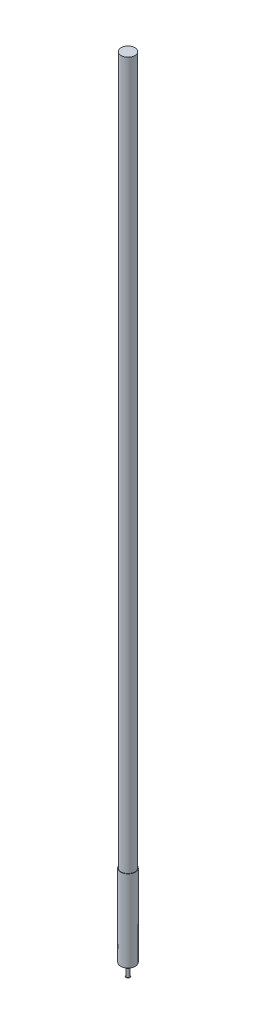
ISO-10303-21;
HEADER;
FILE_DESCRIPTION(('STEP AP214'),'2;1');
FILE_NAME('part.step','',(''),(''),'','','');
FILE_SCHEMA(('AUTOMOTIVE_DESIGN { 1 0 10303 214 1 1 1 1 }'));
ENDSEC;
DATA;
#1=APPLICATION_CONTEXT('core data for automotive mechanical design processes');
#2=APPLICATION_PROTOCOL_DEFINITION('international standard','automotive_design',2000,#1);
#3=PRODUCT_CONTEXT('',#1,'mechanical');
#4=PRODUCT('Part','Part','',(#3));
#5=PRODUCT_RELATED_PRODUCT_CATEGORY('part','',(#4));
#6=PRODUCT_DEFINITION_FORMATION('','',#4);
#7=PRODUCT_DEFINITION_CONTEXT('part definition',#1,'design');
#8=PRODUCT_DEFINITION('design','',#6,#7);
#9=PRODUCT_DEFINITION_SHAPE('','',#8);
#10=(LENGTH_UNIT() NAMED_UNIT(*) SI_UNIT(.MILLI.,.METRE.));
#11=(NAMED_UNIT(*) PLANE_ANGLE_UNIT() SI_UNIT($,.RADIAN.));
#12=(NAMED_UNIT(*) SI_UNIT($,.STERADIAN.) SOLID_ANGLE_UNIT());
#13=UNCERTAINTY_MEASURE_WITH_UNIT(LENGTH_MEASURE(1.E-05),#10,'distance_accuracy_value','');
#14=(GEOMETRIC_REPRESENTATION_CONTEXT(3) GLOBAL_UNCERTAINTY_ASSIGNED_CONTEXT((#13)) GLOBAL_UNIT_ASSIGNED_CONTEXT((#10,
#11,#12)) REPRESENTATION_CONTEXT('',''));
#15=CARTESIAN_POINT('',(0.,0.,0.));
#16=DIRECTION('',(0.,0.,1.));
#17=DIRECTION('',(1.,0.,0.));
#18=AXIS2_PLACEMENT_3D('',#15,#16,#17);
#19=CARTESIAN_POINT('',(0.,-5.,0.));
#20=DIRECTION('',(0.,1.,0.));
#21=DIRECTION('',(0.,0.,1.));
#22=AXIS2_PLACEMENT_3D('',#19,#20,#21);
#23=CONICAL_SURFACE('',#22,0.200000000000003,0.911990290677417);
#24=CARTESIAN_POINT('',(0.,-4.43870967741936,0.));
#25=DIRECTION('',(0.,1.,0.));
#26=DIRECTION('',(0.,0.,1.));
#27=AXIS2_PLACEMENT_3D('',#24,#25,#26);
#28=CIRCLE('',#27,0.925000000000002);
#29=CARTESIAN_POINT('',(0.,-4.43870967741936,0.925000000000002));
#30=VERTEX_POINT('',#29);
#31=EDGE_CURVE('E12',#30,#30,#28,.T.);
#32=CARTESIAN_POINT('',(0.,-5.,0.));
#33=DIRECTION('',(0.,1.,0.));
#34=DIRECTION('',(0.,0.,1.));
#35=AXIS2_PLACEMENT_3D('',#32,#33,#34);
#36=CIRCLE('',#35,0.200000000000003);
#37=CARTESIAN_POINT('',(0.,-5.00000000000001,0.200000000000002));
#38=VERTEX_POINT('',#37);
#39=EDGE_CURVE('E76',#38,#38,#36,.T.);
#40=CARTESIAN_POINT('',(0.,-4.43870967741936,0.925000000000002));
#41=CARTESIAN_POINT('',(0.,-4.4445564516129,0.917447916666669));
#42=CARTESIAN_POINT('',(0.,-4.45040322580645,0.909895833333335));
#43=CARTESIAN_POINT('',(0.,-4.46209677419355,0.894791666666669));
#44=CARTESIAN_POINT('',(0.,-4.4679435483871,0.887239583333335));
#45=CARTESIAN_POINT('',(0.,-4.4796370967742,0.872135416666668));
#46=CARTESIAN_POINT('',(0.,-4.48548387096774,0.864583333333335));
#47=CARTESIAN_POINT('',(0.,-4.49717741935484,0.849479166666669));
#48=CARTESIAN_POINT('',(0.,-4.50302419354839,0.841927083333335));
#49=CARTESIAN_POINT('',(0.,-4.51471774193548,0.826822916666668));
#50=CARTESIAN_POINT('',(0.,-4.52056451612903,0.819270833333335));
#51=CARTESIAN_POINT('',(0.,-4.53225806451613,0.804166666666669));
#52=CARTESIAN_POINT('',(0.,-4.53810483870968,0.796614583333335));
#53=CARTESIAN_POINT('',(0.,-4.54979838709678,0.781510416666668));
#54=CARTESIAN_POINT('',(0.,-4.55564516129033,0.773958333333335));
#55=CARTESIAN_POINT('',(0.,-4.56733870967742,0.758854166666669));
#56=CARTESIAN_POINT('',(0.,-4.57318548387097,0.751302083333335));
#57=CARTESIAN_POINT('',(0.,-4.58487903225807,0.736197916666668));
#58=CARTESIAN_POINT('',(0.,-4.59072580645162,0.728645833333335));
#59=CARTESIAN_POINT('',(0.,-4.60241935483871,0.713541666666669));
#60=CARTESIAN_POINT('',(0.,-4.60826612903226,0.705989583333335));
#61=CARTESIAN_POINT('',(0.,-4.61995967741936,0.690885416666669));
#62=CARTESIAN_POINT('',(0.,-4.62580645161291,0.683333333333335));
#63=CARTESIAN_POINT('',(0.,-4.6375,0.668229166666669));
#64=CARTESIAN_POINT('',(0.,-4.64334677419355,0.660677083333335));
#65=CARTESIAN_POINT('',(0.,-4.65504032258065,0.645572916666668));
#66=CARTESIAN_POINT('',(0.,-4.6608870967742,0.638020833333335));
#67=CARTESIAN_POINT('',(0.,-4.67258064516129,0.622916666666669));
#68=CARTESIAN_POINT('',(0.,-4.67842741935484,0.615364583333335));
#69=CARTESIAN_POINT('',(0.,-4.69012096774194,0.600260416666669));
#70=CARTESIAN_POINT('',(0.,-4.69596774193549,0.592708333333336));
#71=CARTESIAN_POINT('',(0.,-4.70766129032258,0.577604166666669));
#72=CARTESIAN_POINT('',(0.,-4.71350806451613,0.570052083333335));
#73=CARTESIAN_POINT('',(0.,-4.72520161290323,0.554947916666669));
#74=CARTESIAN_POINT('',(0.,-4.73104838709678,0.547395833333336));
#75=CARTESIAN_POINT('',(0.,-4.74274193548387,0.532291666666669));
#76=CARTESIAN_POINT('',(0.,-4.74858870967742,0.524739583333335));
#77=CARTESIAN_POINT('',(0.,-4.76028225806452,0.509635416666669));
#78=CARTESIAN_POINT('',(0.,-4.76612903225807,0.502083333333336));
#79=CARTESIAN_POINT('',(0.,-4.77782258064517,0.486979166666669));
#80=CARTESIAN_POINT('',(0.,-4.78366935483871,0.479427083333335));
#81=CARTESIAN_POINT('',(0.,-4.79536290322581,0.464322916666669));
#82=CARTESIAN_POINT('',(0.,-4.80120967741936,0.456770833333336));
#83=CARTESIAN_POINT('',(0.,-4.81290322580646,0.441666666666669));
#84=CARTESIAN_POINT('',(0.,-4.81875,0.434114583333335));
#85=CARTESIAN_POINT('',(0.,-4.8304435483871,0.419010416666669));
#86=CARTESIAN_POINT('',(0.,-4.83629032258065,0.411458333333335));
#87=CARTESIAN_POINT('',(0.,-4.84798387096775,0.396354166666669));
#88=CARTESIAN_POINT('',(0.,-4.85383064516129,0.388802083333335));
#89=CARTESIAN_POINT('',(0.,-4.86552419354839,0.373697916666669));
#90=CARTESIAN_POINT('',(0.,-4.87137096774194,0.366145833333336));
#91=CARTESIAN_POINT('',(0.,-4.88306451612904,0.351041666666669));
#92=CARTESIAN_POINT('',(0.,-4.88891129032258,0.343489583333335));
#93=CARTESIAN_POINT('',(0.,-4.90060483870968,0.328385416666669));
#94=CARTESIAN_POINT('',(0.,-4.90645161290323,0.320833333333336));
#95=CARTESIAN_POINT('',(0.,-4.91814516129033,0.305729166666669));
#96=CARTESIAN_POINT('',(0.,-4.92399193548388,0.298177083333335));
#97=CARTESIAN_POINT('',(0.,-4.93568548387097,0.283072916666669));
#98=CARTESIAN_POINT('',(0.,-4.94153225806452,0.275520833333336));
#99=CARTESIAN_POINT('',(0.,-4.95322580645162,0.260416666666669));
#100=CARTESIAN_POINT('',(0.,-4.95907258064517,0.252864583333335));
#101=CARTESIAN_POINT('',(0.,-4.97076612903226,0.237760416666669));
#102=CARTESIAN_POINT('',(0.,-4.97661290322581,0.230208333333335));
#103=CARTESIAN_POINT('',(0.,-4.98830645161291,0.215104166666669));
#104=CARTESIAN_POINT('',(0.,-4.99415322580646,0.207552083333336));
#105=CARTESIAN_POINT('',(0.,-5.,0.200000000000002));
#106=B_SPLINE_CURVE_WITH_KNOTS('',3,(#40,#41,#42,#43,#44,#45,#46,#47,#48,#49,#50,#51,#52,#53,
#54,#55,#56,#57,#58,#59,#60,#61,#62,#63,#64,#65,#66,#67,#68,#69,#70,#71,#72,#73,#74,#75,#76,#77,
#78,#79,#80,#81,#82,#83,#84,#85,#86,#87,#88,#89,#90,#91,#92,#93,#94,#95,#96,#97,#98,#99,#100,
#101,#102,#103,#104,#105),.UNSPECIFIED.,.F.,.F.,(4,2,2,2,2,2,2,2,2,2,2,2,2,2,2,2,2,2,2,2,2,2,2,
2,2,2,2,2,2,2,2,2,4),(0.,0.0286525492809213,0.0573050985618416,0.0859576478427629,
0.114610197123683,0.143262746404604,0.171915295685525,0.200567844966446,0.229220394247366,
0.257872943528288,0.286525492809208,0.315178042090129,0.343830591371049,0.372483140651971,
0.401135689932891,0.429788239213812,0.458440788494733,0.487093337775654,0.515745887056574,
0.544398436337495,0.573050985618416,0.601703534899337,0.630356084180257,0.659008633461178,
0.687661182742099,0.71631373202302,0.74496628130394,0.773618830584861,0.802271379865782,
0.830923929146703,0.859576478427623,0.888229027708545,0.916881576989465),.UNSPECIFIED.);
#107=EDGE_CURVE('BSEAM45',#30,#38,#106,.T.);
#108=ORIENTED_EDGE('',*,*,#31,.F.);
#109=ORIENTED_EDGE('',*,*,#39,.T.);
#110=ORIENTED_EDGE('',*,*,#107,.T.);
#111=ORIENTED_EDGE('',*,*,#107,.F.);
#112=EDGE_LOOP('',(#108,#110,#109,#111));
#113=FACE_BOUND('',#112,.T.);
#114=ADVANCED_FACE('F45',(#113),#23,.T.);
#115=CARTESIAN_POINT('',(0.,105.424070967999,0.));
#116=DIRECTION('',(0.,1.,0.));
#117=DIRECTION('',(0.,0.,1.));
#118=AXIS2_PLACEMENT_3D('',#115,#116,#117);
#119=CYLINDRICAL_SURFACE('',#118,0.925000000000002);
#120=CARTESIAN_POINT('',(0.,5.95,0.));
#121=DIRECTION('',(0.,1.,0.));
#122=DIRECTION('',(0.,0.,1.));
#123=AXIS2_PLACEMENT_3D('',#120,#121,#122);
#124=CIRCLE('',#123,0.925000000000002);
#125=CARTESIAN_POINT('',(0.,5.95,0.925000000000002));
#126=VERTEX_POINT('',#125);
#127=EDGE_CURVE('E52',#126,#126,#124,.T.);
#128=ORIENTED_EDGE('',*,*,#127,.F.);
#129=EDGE_LOOP('',(#128));
#130=FACE_BOUND('',#129,.T.);
#131=ORIENTED_EDGE('',*,*,#31,.T.);
#132=EDGE_LOOP('',(#131));
#133=FACE_BOUND('',#132,.T.);
#134=ADVANCED_FACE('F104',(#130,#133),#119,.T.);
#135=CARTESIAN_POINT('',(0.,5.95,-0.925000000000002));
#136=DIRECTION('',(0.,-1.,0.));
#137=DIRECTION('',(0.,0.,-1.));
#138=AXIS2_PLACEMENT_3D('',#135,#136,#137);
#139=PLANE('',#138);
#140=CARTESIAN_POINT('',(0.,5.95,0.));
#141=DIRECTION('',(0.,1.,0.));
#142=DIRECTION('',(0.,0.,1.));
#143=AXIS2_PLACEMENT_3D('',#140,#141,#142);
#144=CIRCLE('',#143,0.875000000000012);
#145=CARTESIAN_POINT('',(0.,5.95,0.875000000000012));
#146=VERTEX_POINT('',#145);
#147=EDGE_CURVE('E58',#146,#146,#144,.T.);
#148=ORIENTED_EDGE('',*,*,#147,.F.);
#149=EDGE_LOOP('',(#148));
#150=FACE_BOUND('',#149,.T.);
#151=ORIENTED_EDGE('',*,*,#127,.T.);
#152=EDGE_LOOP('',(#151));
#153=FACE_BOUND('',#152,.T.);
#154=ADVANCED_FACE('F109',(#150,#153),#139,.F.);
#155=CARTESIAN_POINT('',(0.,105.424070967999,0.));
#156=DIRECTION('',(0.,1.,0.));
#157=DIRECTION('',(0.,0.,1.));
#158=AXIS2_PLACEMENT_3D('',#155,#156,#157);
#159=CYLINDRICAL_SURFACE('',#158,0.875000000000012);
#160=CARTESIAN_POINT('',(0.,95.95,0.));
#161=DIRECTION('',(0.,1.,0.));
#162=DIRECTION('',(0.,0.,1.));
#163=AXIS2_PLACEMENT_3D('',#160,#161,#162);
#164=CIRCLE('',#163,0.875000000000012);
#165=CARTESIAN_POINT('',(0.,95.95,0.875000000000012));
#166=VERTEX_POINT('',#165);
#167=EDGE_CURVE('E63',#166,#166,#164,.T.);
#168=ORIENTED_EDGE('',*,*,#167,.F.);
#169=EDGE_LOOP('',(#168));
#170=FACE_BOUND('',#169,.T.);
#171=ORIENTED_EDGE('',*,*,#147,.T.);
#172=EDGE_LOOP('',(#171));
#173=FACE_BOUND('',#172,.T.);
#174=ADVANCED_FACE('F100',(#170,#173),#159,.T.);
#175=CARTESIAN_POINT('',(0.,95.95,-0.875000000000012));
#176=DIRECTION('',(0.,-1.,0.));
#177=DIRECTION('',(0.,0.,-1.));
#178=AXIS2_PLACEMENT_3D('',#175,#176,#177);
#179=PLANE('',#178);
#180=ORIENTED_EDGE('',*,*,#167,.T.);
#181=EDGE_LOOP('',(#180));
#182=FACE_BOUND('',#181,.T.);
#183=ADVANCED_FACE('F95',(#182),#179,.F.);
#184=CARTESIAN_POINT('',(0.,-5.7375,0.));
#185=DIRECTION('',(0.,1.,0.));
#186=DIRECTION('',(0.,0.,-1.));
#187=AXIS2_PLACEMENT_3D('',#184,#185,#186);
#188=SPHERICAL_SURFACE('',#187,0.3625);
#189=CARTESIAN_POINT('',(0.,-6.00000000000001,0.));
#190=DIRECTION('',(0.,1.,0.));
#191=DIRECTION('',(0.,0.,1.));
#192=AXIS2_PLACEMENT_3D('',#189,#190,#191);
#193=CIRCLE('',#192,0.250000000000002);
#194=CARTESIAN_POINT('',(0.,-6.00000000000001,0.250000000000002));
#195=VERTEX_POINT('',#194);
#196=EDGE_CURVE('E68',#195,#195,#193,.T.);
#197=ORIENTED_EDGE('',*,*,#196,.F.);
#198=EDGE_LOOP('',(#197));
#199=FACE_BOUND('',#198,.T.);
#200=ADVANCED_FACE('F90',(#199),#188,.T.);
#201=CARTESIAN_POINT('',(0.,-6.,-0.250000000000003));
#202=DIRECTION('',(0.,-1.,0.));
#203=DIRECTION('',(0.,0.,-1.));
#204=AXIS2_PLACEMENT_3D('',#201,#202,#203);
#205=PLANE('',#204);
#206=CARTESIAN_POINT('',(0.,-6.00000000000001,0.));
#207=DIRECTION('',(0.,1.,0.));
#208=DIRECTION('',(0.,0.,1.));
#209=AXIS2_PLACEMENT_3D('',#206,#207,#208);
#210=CIRCLE('',#209,0.200000000000003);
#211=CARTESIAN_POINT('',(0.,-6.00000000000001,0.200000000000003));
#212=VERTEX_POINT('',#211);
#213=EDGE_CURVE('E72',#212,#212,#210,.T.);
#214=ORIENTED_EDGE('',*,*,#213,.F.);
#215=EDGE_LOOP('',(#214));
#216=FACE_BOUND('',#215,.T.);
#217=ORIENTED_EDGE('',*,*,#196,.T.);
#218=EDGE_LOOP('',(#217));
#219=FACE_BOUND('',#218,.T.);
#220=ADVANCED_FACE('F84',(#216,#219),#205,.F.);
#221=CARTESIAN_POINT('',(0.,105.424070967999,0.));
#222=DIRECTION('',(0.,1.,0.));
#223=DIRECTION('',(0.,0.,1.));
#224=AXIS2_PLACEMENT_3D('',#221,#222,#223);
#225=CYLINDRICAL_SURFACE('',#224,0.200000000000003);
#226=ORIENTED_EDGE('',*,*,#39,.F.);
#227=EDGE_LOOP('',(#226));
#228=FACE_BOUND('',#227,.T.);
#229=ORIENTED_EDGE('',*,*,#213,.T.);
#230=EDGE_LOOP('',(#229));
#231=FACE_BOUND('',#230,.T.);
#232=ADVANCED_FACE('F81',(#228,#231),#225,.T.);
#233=CLOSED_SHELL('',(#114,#134,#154,#174,#183,#200,#220,#232));
#234=MANIFOLD_SOLID_BREP('B2',#233);
#235=ADVANCED_BREP_SHAPE_REPRESENTATION('',(#18,#234),#14);
#236=SHAPE_DEFINITION_REPRESENTATION(#9,#235);
ENDSEC;
END-ISO-10303-21;
